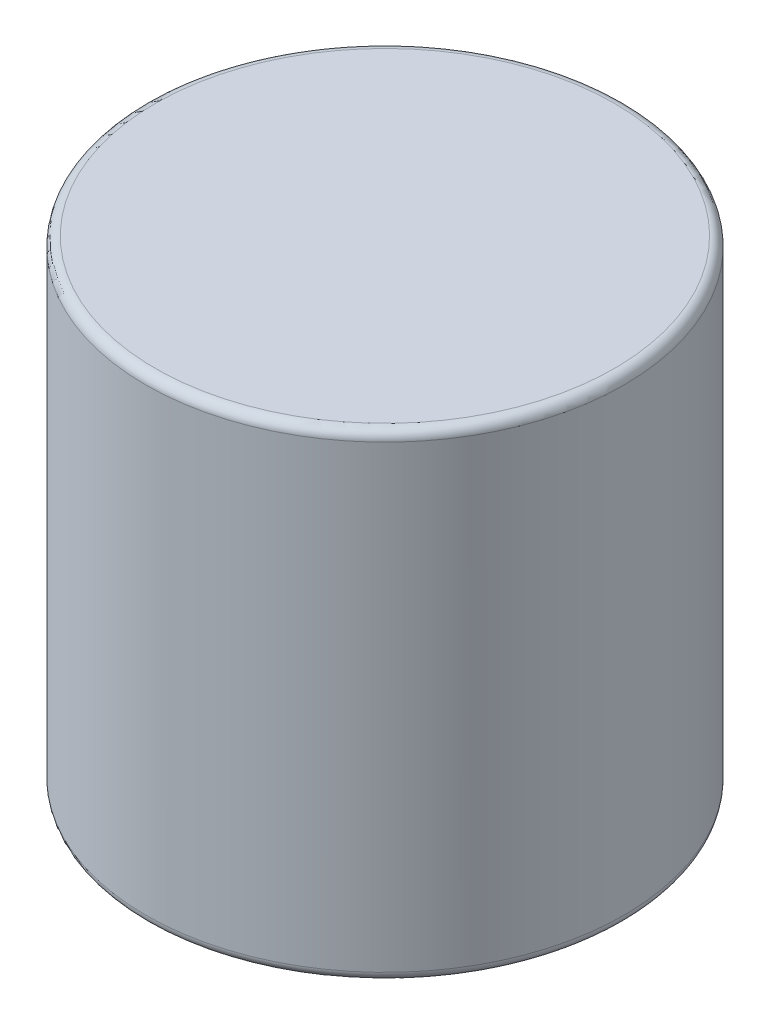
ISO-10303-21;
HEADER;
FILE_DESCRIPTION(('STEP AP214'),'2;1');
FILE_NAME('part.step','',(''),(''),'','','');
FILE_SCHEMA(('AUTOMOTIVE_DESIGN { 1 0 10303 214 1 1 1 1 }'));
ENDSEC;
DATA;
#1=APPLICATION_CONTEXT('core data for automotive mechanical design processes');
#2=APPLICATION_PROTOCOL_DEFINITION('international standard','automotive_design',2000,#1);
#3=PRODUCT_CONTEXT('',#1,'mechanical');
#4=PRODUCT('Part','Part','',(#3));
#5=PRODUCT_RELATED_PRODUCT_CATEGORY('part','',(#4));
#6=PRODUCT_DEFINITION_FORMATION('','',#4);
#7=PRODUCT_DEFINITION_CONTEXT('part definition',#1,'design');
#8=PRODUCT_DEFINITION('design','',#6,#7);
#9=PRODUCT_DEFINITION_SHAPE('','',#8);
#10=(LENGTH_UNIT() NAMED_UNIT(*) SI_UNIT(.MILLI.,.METRE.));
#11=(NAMED_UNIT(*) PLANE_ANGLE_UNIT() SI_UNIT($,.RADIAN.));
#12=(NAMED_UNIT(*) SI_UNIT($,.STERADIAN.) SOLID_ANGLE_UNIT());
#13=UNCERTAINTY_MEASURE_WITH_UNIT(LENGTH_MEASURE(1.E-05),#10,'distance_accuracy_value','');
#14=(GEOMETRIC_REPRESENTATION_CONTEXT(3) GLOBAL_UNCERTAINTY_ASSIGNED_CONTEXT((#13)) GLOBAL_UNIT_ASSIGNED_CONTEXT((#10,
#11,#12)) REPRESENTATION_CONTEXT('',''));
#15=CARTESIAN_POINT('',(0.,0.,0.));
#16=DIRECTION('',(0.,0.,1.));
#17=DIRECTION('',(1.,0.,0.));
#18=AXIS2_PLACEMENT_3D('',#15,#16,#17);
#19=CARTESIAN_POINT('',(0.,2.5,0.));
#20=DIRECTION('',(0.,1.,0.));
#21=DIRECTION('',(0.,0.,1.));
#22=AXIS2_PLACEMENT_3D('',#19,#20,#21);
#23=CYLINDRICAL_SURFACE('',#22,2.5);
#24=CARTESIAN_POINT('',(0.,-2.4,0.));
#25=DIRECTION('',(0.,1.,0.));
#26=DIRECTION('',(0.,0.,1.));
#27=AXIS2_PLACEMENT_3D('',#24,#25,#26);
#28=CIRCLE('',#27,2.5);
#29=CARTESIAN_POINT('',(0.,-2.4,2.5));
#30=VERTEX_POINT('',#29);
#31=EDGE_CURVE('E41',#30,#30,#28,.T.);
#32=ORIENTED_EDGE('',*,*,#31,.T.);
#33=EDGE_LOOP('',(#32));
#34=FACE_BOUND('',#33,.T.);
#35=CARTESIAN_POINT('',(0.,2.4,0.));
#36=DIRECTION('',(0.,-1.,0.));
#37=DIRECTION('',(0.,0.,-1.));
#38=AXIS2_PLACEMENT_3D('',#35,#36,#37);
#39=CIRCLE('',#38,2.5);
#40=CARTESIAN_POINT('',(0.,2.4,-2.5));
#41=VERTEX_POINT('',#40);
#42=EDGE_CURVE('E45',#41,#41,#39,.T.);
#43=ORIENTED_EDGE('',*,*,#42,.T.);
#44=EDGE_LOOP('',(#43));
#45=FACE_BOUND('',#44,.T.);
#46=ADVANCED_FACE('F30',(#34,#45),#23,.T.);
#47=CARTESIAN_POINT('',(0.,2.5,0.));
#48=DIRECTION('',(0.,-1.,0.));
#49=DIRECTION('',(0.,0.,-1.));
#50=AXIS2_PLACEMENT_3D('',#47,#48,#49);
#51=PLANE('',#50);
#52=CARTESIAN_POINT('',(0.,2.5,0.));
#53=DIRECTION('',(0.,-1.,0.));
#54=DIRECTION('',(0.,0.,-1.));
#55=AXIS2_PLACEMENT_3D('',#52,#53,#54);
#56=CIRCLE('',#55,2.4);
#57=CARTESIAN_POINT('',(0.,2.5,-2.4));
#58=VERTEX_POINT('',#57);
#59=EDGE_CURVE('E10',#58,#58,#56,.F.);
#60=ORIENTED_EDGE('',*,*,#59,.T.);
#61=EDGE_LOOP('',(#60));
#62=FACE_BOUND('',#61,.T.);
#63=ADVANCED_FACE('F61',(#62),#51,.F.);
#64=CARTESIAN_POINT('',(0.,-2.5,0.));
#65=DIRECTION('',(0.,1.,0.));
#66=DIRECTION('',(0.,0.,1.));
#67=AXIS2_PLACEMENT_3D('',#64,#65,#66);
#68=PLANE('',#67);
#69=CARTESIAN_POINT('',(0.,-2.5,0.));
#70=DIRECTION('',(0.,1.,0.));
#71=DIRECTION('',(0.,0.,1.));
#72=AXIS2_PLACEMENT_3D('',#69,#70,#71);
#73=CIRCLE('',#72,2.4);
#74=CARTESIAN_POINT('',(0.,-2.5,2.4));
#75=VERTEX_POINT('',#74);
#76=EDGE_CURVE('E37',#75,#75,#73,.F.);
#77=ORIENTED_EDGE('',*,*,#76,.T.);
#78=EDGE_LOOP('',(#77));
#79=FACE_BOUND('',#78,.T.);
#80=ADVANCED_FACE('F58',(#79),#68,.F.);
#81=CARTESIAN_POINT('',(0.,-2.4,0.));
#82=DIRECTION('',(0.,1.,0.));
#83=DIRECTION('',(0.,0.,1.));
#84=AXIS2_PLACEMENT_3D('',#81,#82,#83);
#85=TOROIDAL_SURFACE('',#84,2.4,0.1);
#86=ORIENTED_EDGE('',*,*,#76,.F.);
#87=EDGE_LOOP('',(#86));
#88=FACE_BOUND('',#87,.T.);
#89=ORIENTED_EDGE('',*,*,#31,.F.);
#90=EDGE_LOOP('',(#89));
#91=FACE_BOUND('',#90,.T.);
#92=ADVANCED_FACE('F54',(#88,#91),#85,.T.);
#93=CARTESIAN_POINT('',(0.,2.4,0.));
#94=DIRECTION('',(0.,-1.,0.));
#95=DIRECTION('',(0.,0.,-1.));
#96=AXIS2_PLACEMENT_3D('',#93,#94,#95);
#97=TOROIDAL_SURFACE('',#96,2.4,0.1);
#98=ORIENTED_EDGE('',*,*,#42,.F.);
#99=EDGE_LOOP('',(#98));
#100=FACE_BOUND('',#99,.T.);
#101=ORIENTED_EDGE('',*,*,#59,.F.);
#102=EDGE_LOOP('',(#101));
#103=FACE_BOUND('',#102,.T.);
#104=ADVANCED_FACE('F32',(#100,#103),#97,.T.);
#105=CLOSED_SHELL('',(#46,#63,#80,#92,#104));
#106=MANIFOLD_SOLID_BREP('B2',#105);
#107=ADVANCED_BREP_SHAPE_REPRESENTATION('',(#18,#106),#14);
#108=SHAPE_DEFINITION_REPRESENTATION(#9,#107);
ENDSEC;
END-ISO-10303-21;
